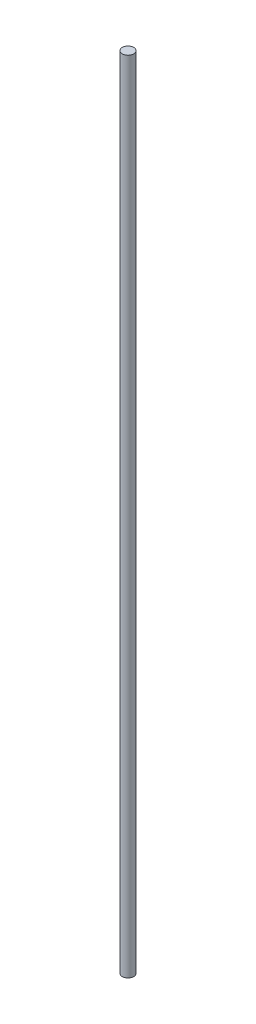
ISO-10303-21;
HEADER;
FILE_DESCRIPTION(('STEP AP214'),'2;1');
FILE_NAME('part.step','',(''),(''),'','','');
FILE_SCHEMA(('AUTOMOTIVE_DESIGN { 1 0 10303 214 1 1 1 1 }'));
ENDSEC;
DATA;
#1=APPLICATION_CONTEXT('core data for automotive mechanical design processes');
#2=APPLICATION_PROTOCOL_DEFINITION('international standard','automotive_design',2000,#1);
#3=PRODUCT_CONTEXT('',#1,'mechanical');
#4=PRODUCT('Part','Part','',(#3));
#5=PRODUCT_RELATED_PRODUCT_CATEGORY('part','',(#4));
#6=PRODUCT_DEFINITION_FORMATION('','',#4);
#7=PRODUCT_DEFINITION_CONTEXT('part definition',#1,'design');
#8=PRODUCT_DEFINITION('design','',#6,#7);
#9=PRODUCT_DEFINITION_SHAPE('','',#8);
#10=(LENGTH_UNIT() NAMED_UNIT(*) SI_UNIT(.MILLI.,.METRE.));
#11=(NAMED_UNIT(*) PLANE_ANGLE_UNIT() SI_UNIT($,.RADIAN.));
#12=(NAMED_UNIT(*) SI_UNIT($,.STERADIAN.) SOLID_ANGLE_UNIT());
#13=UNCERTAINTY_MEASURE_WITH_UNIT(LENGTH_MEASURE(1.E-05),#10,'distance_accuracy_value','');
#14=(GEOMETRIC_REPRESENTATION_CONTEXT(3) GLOBAL_UNCERTAINTY_ASSIGNED_CONTEXT((#13)) GLOBAL_UNIT_ASSIGNED_CONTEXT((#10,
#11,#12)) REPRESENTATION_CONTEXT('',''));
#15=CARTESIAN_POINT('',(0.,0.,0.));
#16=DIRECTION('',(0.,0.,1.));
#17=DIRECTION('',(1.,0.,0.));
#18=AXIS2_PLACEMENT_3D('',#15,#16,#17);
#19=CARTESIAN_POINT('',(0.,558.8,0.));
#20=DIRECTION('',(0.,-1.,0.));
#21=DIRECTION('',(0.,0.,-1.));
#22=AXIS2_PLACEMENT_3D('',#19,#20,#21);
#23=CYLINDRICAL_SURFACE('',#22,3.96875);
#24=CARTESIAN_POINT('',(0.,558.8,0.));
#25=DIRECTION('',(0.,1.,0.));
#26=DIRECTION('',(0.,0.,1.));
#27=AXIS2_PLACEMENT_3D('',#24,#25,#26);
#28=CIRCLE('',#27,3.96875);
#29=CARTESIAN_POINT('',(0.,558.8,3.96875));
#30=VERTEX_POINT('',#29);
#31=EDGE_CURVE('E10',#30,#30,#28,.T.);
#32=ORIENTED_EDGE('',*,*,#31,.F.);
#33=EDGE_LOOP('',(#32));
#34=FACE_BOUND('',#33,.T.);
#35=CARTESIAN_POINT('',(0.,0.,0.));
#36=DIRECTION('',(0.,1.,0.));
#37=DIRECTION('',(0.,0.,1.));
#38=AXIS2_PLACEMENT_3D('',#35,#36,#37);
#39=CIRCLE('',#38,3.96875);
#40=CARTESIAN_POINT('',(0.,0.,3.96875));
#41=VERTEX_POINT('',#40);
#42=EDGE_CURVE('E40',#41,#41,#39,.T.);
#43=ORIENTED_EDGE('',*,*,#42,.T.);
#44=EDGE_LOOP('',(#43));
#45=FACE_BOUND('',#44,.T.);
#46=ADVANCED_FACE('F37',(#34,#45),#23,.T.);
#47=CARTESIAN_POINT('',(0.,558.8,0.));
#48=DIRECTION('',(0.,1.,0.));
#49=DIRECTION('',(0.,0.,1.));
#50=AXIS2_PLACEMENT_3D('',#47,#48,#49);
#51=PLANE('',#50);
#52=ORIENTED_EDGE('',*,*,#31,.T.);
#53=EDGE_LOOP('',(#52));
#54=FACE_BOUND('',#53,.T.);
#55=ADVANCED_FACE('F52',(#54),#51,.T.);
#56=CARTESIAN_POINT('',(0.,0.,0.));
#57=DIRECTION('',(0.,1.,0.));
#58=DIRECTION('',(0.,0.,1.));
#59=AXIS2_PLACEMENT_3D('',#56,#57,#58);
#60=PLANE('',#59);
#61=ORIENTED_EDGE('',*,*,#42,.F.);
#62=EDGE_LOOP('',(#61));
#63=FACE_BOUND('',#62,.T.);
#64=ADVANCED_FACE('F50',(#63),#60,.F.);
#65=CLOSED_SHELL('',(#46,#55,#64));
#66=MANIFOLD_SOLID_BREP('B2',#65);
#67=ADVANCED_BREP_SHAPE_REPRESENTATION('',(#18,#66),#14);
#68=SHAPE_DEFINITION_REPRESENTATION(#9,#67);
ENDSEC;
END-ISO-10303-21;
